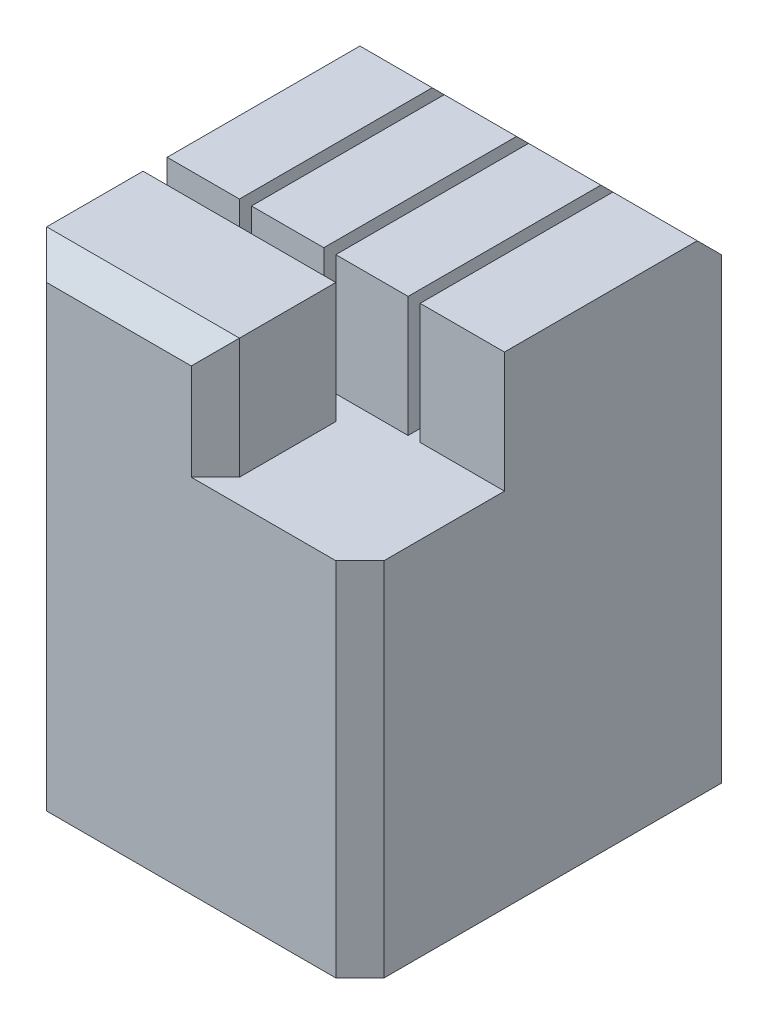
ISO-10303-21;
HEADER;
FILE_DESCRIPTION(('STEP AP214'),'2;1');
FILE_NAME('part.step','',(''),(''),'','','');
FILE_SCHEMA(('AUTOMOTIVE_DESIGN { 1 0 10303 214 1 1 1 1 }'));
ENDSEC;
DATA;
#1=APPLICATION_CONTEXT('core data for automotive mechanical design processes');
#2=APPLICATION_PROTOCOL_DEFINITION('international standard','automotive_design',2000,#1);
#3=PRODUCT_CONTEXT('',#1,'mechanical');
#4=PRODUCT('Part','Part','',(#3));
#5=PRODUCT_RELATED_PRODUCT_CATEGORY('part','',(#4));
#6=PRODUCT_DEFINITION_FORMATION('','',#4);
#7=PRODUCT_DEFINITION_CONTEXT('part definition',#1,'design');
#8=PRODUCT_DEFINITION('design','',#6,#7);
#9=PRODUCT_DEFINITION_SHAPE('','',#8);
#10=(LENGTH_UNIT() NAMED_UNIT(*) SI_UNIT(.MILLI.,.METRE.));
#11=(NAMED_UNIT(*) PLANE_ANGLE_UNIT() SI_UNIT($,.RADIAN.));
#12=(NAMED_UNIT(*) SI_UNIT($,.STERADIAN.) SOLID_ANGLE_UNIT());
#13=UNCERTAINTY_MEASURE_WITH_UNIT(LENGTH_MEASURE(1.E-05),#10,'distance_accuracy_value','');
#14=(GEOMETRIC_REPRESENTATION_CONTEXT(3) GLOBAL_UNCERTAINTY_ASSIGNED_CONTEXT((#13)) GLOBAL_UNIT_ASSIGNED_CONTEXT((#10,
#11,#12)) REPRESENTATION_CONTEXT('',''));
#15=CARTESIAN_POINT('',(0.,0.,0.));
#16=DIRECTION('',(0.,0.,1.));
#17=DIRECTION('',(1.,0.,0.));
#18=AXIS2_PLACEMENT_3D('',#15,#16,#17);
#19=CARTESIAN_POINT('',(7.,-8.,-8.));
#20=DIRECTION('',(0.,-1.,0.));
#21=DIRECTION('',(0.,0.,-1.));
#22=AXIS2_PLACEMENT_3D('',#19,#20,#21);
#23=PLANE('',#22);
#24=CARTESIAN_POINT('',(7.,-8.,-8.));
#25=DIRECTION('',(0.,-1.,0.));
#26=DIRECTION('',(0.,0.,-1.));
#27=AXIS2_PLACEMENT_3D('',#24,#25,#26);
#28=CIRCLE('',#27,5.);
#29=CARTESIAN_POINT('',(7.,-8.,-13.));
#30=VERTEX_POINT('',#29);
#31=CARTESIAN_POINT('',(7.,-8.,-3.));
#32=VERTEX_POINT('',#31);
#33=EDGE_CURVE('E10',#30,#32,#28,.T.);
#34=ORIENTED_EDGE('',*,*,#33,.T.);
#35=CARTESIAN_POINT('',(7.,-8.,-8.));
#36=DIRECTION('',(0.,-1.,0.));
#37=DIRECTION('',(0.,0.,-1.));
#38=AXIS2_PLACEMENT_3D('',#35,#36,#37);
#39=CIRCLE('',#38,5.);
#40=EDGE_CURVE('E435',#32,#30,#39,.T.);
#41=ORIENTED_EDGE('',*,*,#40,.T.);
#42=EDGE_LOOP('',(#34,#41));
#43=FACE_BOUND('',#42,.T.);
#44=ADVANCED_FACE('F16',(#43),#23,.T.);
#45=CARTESIAN_POINT('',(7.,-8.,-8.));
#46=DIRECTION('',(0.,-1.,0.));
#47=DIRECTION('',(0.,0.,-1.));
#48=AXIS2_PLACEMENT_3D('',#45,#46,#47);
#49=CYLINDRICAL_SURFACE('',#48,5.);
#50=DIRECTION('',(0.,-1.,0.));
#51=VECTOR('',#50,1.);
#52=CARTESIAN_POINT('',(7.,-8.,-3.));
#53=LINE('',#52,#51);
#54=CARTESIAN_POINT('',(7.,-20.,-3.));
#55=VERTEX_POINT('',#54);
#56=EDGE_CURVE('E439',#32,#55,#53,.T.);
#57=ORIENTED_EDGE('',*,*,#56,.F.);
#58=ORIENTED_EDGE('',*,*,#33,.F.);
#59=DIRECTION('',(0.,-1.,0.));
#60=VECTOR('',#59,1.);
#61=CARTESIAN_POINT('',(7.,-8.,-13.));
#62=LINE('',#61,#60);
#63=CARTESIAN_POINT('',(7.,-20.,-13.));
#64=VERTEX_POINT('',#63);
#65=EDGE_CURVE('E570',#30,#64,#62,.T.);
#66=ORIENTED_EDGE('',*,*,#65,.T.);
#67=CARTESIAN_POINT('',(7.,-20.,-8.));
#68=DIRECTION('',(0.,-1.,0.));
#69=DIRECTION('',(0.,0.,-1.));
#70=AXIS2_PLACEMENT_3D('',#67,#68,#69);
#71=CIRCLE('',#70,5.);
#72=EDGE_CURVE('E618',#64,#55,#71,.T.);
#73=ORIENTED_EDGE('',*,*,#72,.T.);
#74=EDGE_LOOP('',(#57,#58,#66,#73));
#75=FACE_BOUND('',#74,.T.);
#76=ADVANCED_FACE('F798',(#75),#49,.F.);
#77=CARTESIAN_POINT('',(7.,-20.,0.));
#78=DIRECTION('',(0.707106781186546,0.,0.707106781186549));
#79=DIRECTION('',(0.,-1.,0.));
#80=AXIS2_PLACEMENT_3D('',#77,#78,#79);
#81=PLANE('',#80);
#82=DIRECTION('',(-0.707106781186549,0.,0.707106781186546));
#83=VECTOR('',#82,1.);
#84=CARTESIAN_POINT('',(7.,-5.,0.));
#85=LINE('',#84,#83);
#86=CARTESIAN_POINT('',(8.,-5.,-1.));
#87=VERTEX_POINT('',#86);
#88=CARTESIAN_POINT('',(7.,-5.,0.));
#89=VERTEX_POINT('',#88);
#90=EDGE_CURVE('E40',#87,#89,#85,.T.);
#91=ORIENTED_EDGE('',*,*,#90,.F.);
#92=DIRECTION('',(0.,-1.,0.));
#93=VECTOR('',#92,1.);
#94=CARTESIAN_POINT('',(8.,-5.,-1.));
#95=LINE('',#94,#93);
#96=CARTESIAN_POINT('',(8.,0.,-1.));
#97=VERTEX_POINT('',#96);
#98=EDGE_CURVE('E359',#97,#87,#95,.T.);
#99=ORIENTED_EDGE('',*,*,#98,.F.);
#100=DIRECTION('',(-0.577350269189626,-0.577350269189626,0.577350269189625));
#101=VECTOR('',#100,1.);
#102=CARTESIAN_POINT('',(5.33333333333333,-2.66666666666667,1.66666666666666));
#103=LINE('',#102,#101);
#104=CARTESIAN_POINT('',(7.,-1.,0.));
#105=VERTEX_POINT('',#104);
#106=EDGE_CURVE('E26',#97,#105,#103,.T.);
#107=ORIENTED_EDGE('',*,*,#106,.T.);
#108=DIRECTION('',(0.,1.,0.));
#109=VECTOR('',#108,1.);
#110=CARTESIAN_POINT('',(7.,0.,0.));
#111=LINE('',#110,#109);
#112=EDGE_CURVE('E356',#89,#105,#111,.T.);
#113=ORIENTED_EDGE('',*,*,#112,.F.);
#114=EDGE_LOOP('',(#91,#99,#107,#113));
#115=FACE_BOUND('',#114,.T.);
#116=ADVANCED_FACE('F354',(#115),#81,.T.);
#117=CARTESIAN_POINT('',(0.,0.,-1.));
#118=DIRECTION('',(0.,0.707106781186546,0.707106781186549));
#119=DIRECTION('',(1.,0.,0.));
#120=AXIS2_PLACEMENT_3D('',#117,#118,#119);
#121=PLANE('',#120);
#122=DIRECTION('',(0.577350269189626,-0.577350269189626,0.577350269189625));
#123=VECTOR('',#122,1.);
#124=CARTESIAN_POINT('',(0.,0.,-1.));
#125=LINE('',#124,#123);
#126=CARTESIAN_POINT('',(0.,0.,-1.));
#127=VERTEX_POINT('',#126);
#128=CARTESIAN_POINT('',(1.,-1.,0.));
#129=VERTEX_POINT('',#128);
#130=EDGE_CURVE('E349',#127,#129,#125,.T.);
#131=ORIENTED_EDGE('',*,*,#130,.T.);
#132=DIRECTION('',(-1.,0.,0.));
#133=VECTOR('',#132,1.);
#134=CARTESIAN_POINT('',(0.,-1.,0.));
#135=LINE('',#134,#133);
#136=EDGE_CURVE('E364',#105,#129,#135,.T.);
#137=ORIENTED_EDGE('',*,*,#136,.F.);
#138=ORIENTED_EDGE('',*,*,#106,.F.);
#139=DIRECTION('',(1.,0.,0.));
#140=VECTOR('',#139,1.);
#141=CARTESIAN_POINT('',(8.,0.,-1.));
#142=LINE('',#141,#140);
#143=EDGE_CURVE('E613',#127,#97,#142,.T.);
#144=ORIENTED_EDGE('',*,*,#143,.F.);
#145=EDGE_LOOP('',(#131,#137,#138,#144));
#146=FACE_BOUND('',#145,.T.);
#147=ADVANCED_FACE('F365',(#146),#121,.T.);
#148=CARTESIAN_POINT('',(0.,-20.,-1.));
#149=DIRECTION('',(0.707106781186546,0.,-0.707106781186549));
#150=DIRECTION('',(0.,-1.,0.));
#151=AXIS2_PLACEMENT_3D('',#148,#149,#150);
#152=PLANE('',#151);
#153=DIRECTION('',(-0.707106781186549,0.,-0.707106781186546));
#154=VECTOR('',#153,1.);
#155=CARTESIAN_POINT('',(0.5,-20.,-0.5));
#156=LINE('',#155,#154);
#157=CARTESIAN_POINT('',(1.,-20.,0.));
#158=VERTEX_POINT('',#157);
#159=CARTESIAN_POINT('',(0.,-20.,-1.));
#160=VERTEX_POINT('',#159);
#161=EDGE_CURVE('E330',#158,#160,#156,.T.);
#162=ORIENTED_EDGE('',*,*,#161,.F.);
#163=DIRECTION('',(0.,-1.,0.));
#164=VECTOR('',#163,1.);
#165=CARTESIAN_POINT('',(1.,-20.,0.));
#166=LINE('',#165,#164);
#167=EDGE_CURVE('E369',#129,#158,#166,.T.);
#168=ORIENTED_EDGE('',*,*,#167,.F.);
#169=ORIENTED_EDGE('',*,*,#130,.F.);
#170=DIRECTION('',(0.,1.,0.));
#171=VECTOR('',#170,1.);
#172=CARTESIAN_POINT('',(0.,-20.,-1.));
#173=LINE('',#172,#171);
#174=EDGE_CURVE('E514',#160,#127,#173,.T.);
#175=ORIENTED_EDGE('',*,*,#174,.F.);
#176=EDGE_LOOP('',(#162,#168,#169,#175));
#177=FACE_BOUND('',#176,.T.);
#178=ADVANCED_FACE('F780',(#177),#152,.F.);
#179=CARTESIAN_POINT('',(14.,-20.,-15.));
#180=DIRECTION('',(-0.707106781186545,0.,0.70710678118655));
#181=DIRECTION('',(0.,1.,0.));
#182=AXIS2_PLACEMENT_3D('',#179,#180,#181);
#183=PLANE('',#182);
#184=DIRECTION('',(0.70710678118655,0.,0.707106781186545));
#185=VECTOR('',#184,1.);
#186=CARTESIAN_POINT('',(14.5,-20.,-14.5));
#187=LINE('',#186,#185);
#188=CARTESIAN_POINT('',(13.,-20.,-16.));
#189=VERTEX_POINT('',#188);
#190=CARTESIAN_POINT('',(14.,-20.,-15.));
#191=VERTEX_POINT('',#190);
#192=EDGE_CURVE('E657',#189,#191,#187,.T.);
#193=ORIENTED_EDGE('',*,*,#192,.F.);
#194=DIRECTION('',(0.,-1.,0.));
#195=VECTOR('',#194,1.);
#196=CARTESIAN_POINT('',(13.,-20.,-16.));
#197=LINE('',#196,#195);
#198=CARTESIAN_POINT('',(13.,-2.,-16.));
#199=VERTEX_POINT('',#198);
#200=EDGE_CURVE('E537',#199,#189,#197,.T.);
#201=ORIENTED_EDGE('',*,*,#200,.F.);
#202=DIRECTION('',(-0.577350269189627,-0.577350269189626,-0.577350269189624));
#203=VECTOR('',#202,1.);
#204=CARTESIAN_POINT('',(10.,-5.,-19.));
#205=LINE('',#204,#203);
#206=CARTESIAN_POINT('',(14.,-1.,-15.));
#207=VERTEX_POINT('',#206);
#208=EDGE_CURVE('E520',#207,#199,#205,.T.);
#209=ORIENTED_EDGE('',*,*,#208,.F.);
#210=DIRECTION('',(0.,1.,0.));
#211=VECTOR('',#210,1.);
#212=CARTESIAN_POINT('',(14.,-20.,-15.));
#213=LINE('',#212,#211);
#214=EDGE_CURVE('E479',#191,#207,#213,.T.);
#215=ORIENTED_EDGE('',*,*,#214,.F.);
#216=EDGE_LOOP('',(#193,#201,#209,#215));
#217=FACE_BOUND('',#216,.T.);
#218=ADVANCED_FACE('F656',(#217),#183,.F.);
#219=CARTESIAN_POINT('',(1.,-20.,-16.));
#220=DIRECTION('',(0.707106781186549,0.,0.707106781186546));
#221=DIRECTION('',(0.,-1.,0.));
#222=AXIS2_PLACEMENT_3D('',#219,#220,#221);
#223=PLANE('',#222);
#224=DIRECTION('',(0.707106781186546,0.,-0.707106781186549));
#225=VECTOR('',#224,1.);
#226=CARTESIAN_POINT('',(-7.5,-20.,-7.5));
#227=LINE('',#226,#225);
#228=CARTESIAN_POINT('',(0.,-20.,-15.));
#229=VERTEX_POINT('',#228);
#230=CARTESIAN_POINT('',(1.,-20.,-16.));
#231=VERTEX_POINT('',#230);
#232=EDGE_CURVE('E233',#229,#231,#227,.T.);
#233=ORIENTED_EDGE('',*,*,#232,.F.);
#234=DIRECTION('',(0.,-1.,0.));
#235=VECTOR('',#234,1.);
#236=CARTESIAN_POINT('',(0.,-20.,-15.));
#237=LINE('',#236,#235);
#238=CARTESIAN_POINT('',(0.,-1.,-15.));
#239=VERTEX_POINT('',#238);
#240=EDGE_CURVE('E442',#239,#229,#237,.T.);
#241=ORIENTED_EDGE('',*,*,#240,.F.);
#242=DIRECTION('',(-0.577350269189624,0.577350269189629,0.577350269189625));
#243=VECTOR('',#242,1.);
#244=CARTESIAN_POINT('',(-0.666666666666663,-0.33333333333333,-14.3333333333333));
#245=LINE('',#244,#243);
#246=CARTESIAN_POINT('',(1.,-2.,-16.));
#247=VERTEX_POINT('',#246);
#248=EDGE_CURVE('E217',#247,#239,#245,.T.);
#249=ORIENTED_EDGE('',*,*,#248,.F.);
#250=DIRECTION('',(0.,1.,0.));
#251=VECTOR('',#250,1.);
#252=CARTESIAN_POINT('',(1.,-20.,-16.));
#253=LINE('',#252,#251);
#254=EDGE_CURVE('E492',#231,#247,#253,.T.);
#255=ORIENTED_EDGE('',*,*,#254,.F.);
#256=EDGE_LOOP('',(#233,#241,#249,#255));
#257=FACE_BOUND('',#256,.T.);
#258=ADVANCED_FACE('F850',(#257),#223,.F.);
#259=CARTESIAN_POINT('',(13.,-20.,0.));
#260=DIRECTION('',(-0.707106781186549,0.,-0.707106781186546));
#261=DIRECTION('',(-0.707106781186546,0.,0.707106781186549));
#262=AXIS2_PLACEMENT_3D('',#259,#260,#261);
#263=PLANE('',#262);
#264=DIRECTION('',(-0.707106781186546,0.,0.707106781186549));
#265=VECTOR('',#264,1.);
#266=CARTESIAN_POINT('',(6.5,-20.,6.5));
#267=LINE('',#266,#265);
#268=CARTESIAN_POINT('',(14.,-20.,-1.));
#269=VERTEX_POINT('',#268);
#270=CARTESIAN_POINT('',(13.,-20.,0.));
#271=VERTEX_POINT('',#270);
#272=EDGE_CURVE('E450',#269,#271,#267,.T.);
#273=ORIENTED_EDGE('',*,*,#272,.F.);
#274=DIRECTION('',(0.,-1.,0.));
#275=VECTOR('',#274,1.);
#276=CARTESIAN_POINT('',(14.,-20.,-1.));
#277=LINE('',#276,#275);
#278=CARTESIAN_POINT('',(14.,-5.,-1.));
#279=VERTEX_POINT('',#278);
#280=EDGE_CURVE('E420',#279,#269,#277,.T.);
#281=ORIENTED_EDGE('',*,*,#280,.F.);
#282=DIRECTION('',(0.707106781186546,0.,-0.707106781186549));
#283=VECTOR('',#282,1.);
#284=CARTESIAN_POINT('',(6.5,-5.,6.5));
#285=LINE('',#284,#283);
#286=CARTESIAN_POINT('',(13.,-5.,0.));
#287=VERTEX_POINT('',#286);
#288=EDGE_CURVE('E433',#287,#279,#285,.T.);
#289=ORIENTED_EDGE('',*,*,#288,.F.);
#290=DIRECTION('',(0.,1.,0.));
#291=VECTOR('',#290,1.);
#292=CARTESIAN_POINT('',(13.,-20.,0.));
#293=LINE('',#292,#291);
#294=EDGE_CURVE('E382',#271,#287,#293,.T.);
#295=ORIENTED_EDGE('',*,*,#294,.F.);
#296=EDGE_LOOP('',(#273,#281,#289,#295));
#297=FACE_BOUND('',#296,.T.);
#298=ADVANCED_FACE('F861',(#297),#263,.F.);
#299=CARTESIAN_POINT('',(0.,0.,-14.));
#300=DIRECTION('',(0.,0.707106781186546,-0.707106781186549));
#301=DIRECTION('',(-1.,0.,0.));
#302=AXIS2_PLACEMENT_3D('',#299,#300,#301);
#303=PLANE('',#302);
#304=DIRECTION('',(0.,0.707106781186549,0.707106781186546));
#305=VECTOR('',#304,1.);
#306=CARTESIAN_POINT('',(14.,-3.00000000000005,-17.));
#307=LINE('',#306,#305);
#308=CARTESIAN_POINT('',(14.,0.,-14.));
#309=VERTEX_POINT('',#308);
#310=EDGE_CURVE('E483',#207,#309,#307,.T.);
#311=ORIENTED_EDGE('',*,*,#310,.F.);
#312=ORIENTED_EDGE('',*,*,#208,.T.);
#313=DIRECTION('',(1.,0.,0.));
#314=VECTOR('',#313,1.);
#315=CARTESIAN_POINT('',(14.,-2.,-16.));
#316=LINE('',#315,#314);
#317=CARTESIAN_POINT('',(10.5,-2.,-16.));
#318=VERTEX_POINT('',#317);
#319=EDGE_CURVE('E605',#318,#199,#316,.T.);
#320=ORIENTED_EDGE('',*,*,#319,.F.);
#321=DIRECTION('',(0.,-0.707106781186549,-0.707106781186546));
#322=VECTOR('',#321,1.);
#323=CARTESIAN_POINT('',(10.5,4.5,-9.5));
#324=LINE('',#323,#322);
#325=CARTESIAN_POINT('',(10.5,0.,-14.));
#326=VERTEX_POINT('',#325);
#327=EDGE_CURVE('E133',#326,#318,#324,.T.);
#328=ORIENTED_EDGE('',*,*,#327,.F.);
#329=DIRECTION('',(-1.,0.,0.));
#330=VECTOR('',#329,1.);
#331=CARTESIAN_POINT('',(10.5,0.,-14.));
#332=LINE('',#331,#330);
#333=EDGE_CURVE('E544',#309,#326,#332,.T.);
#334=ORIENTED_EDGE('',*,*,#333,.F.);
#335=EDGE_LOOP('',(#311,#312,#320,#328,#334));
#336=FACE_BOUND('',#335,.T.);
#337=ADVANCED_FACE('F651',(#336),#303,.T.);
#338=CARTESIAN_POINT('',(0.,0.,-14.));
#339=DIRECTION('',(0.,0.707106781186546,-0.707106781186549));
#340=DIRECTION('',(-1.,0.,0.));
#341=AXIS2_PLACEMENT_3D('',#338,#339,#340);
#342=PLANE('',#341);
#343=DIRECTION('',(0.,0.707106781186549,0.707106781186546));
#344=VECTOR('',#343,1.);
#345=CARTESIAN_POINT('',(10.,0.,-14.));
#346=LINE('',#345,#344);
#347=CARTESIAN_POINT('',(10.,-2.,-16.));
#348=VERTEX_POINT('',#347);
#349=CARTESIAN_POINT('',(10.,0.,-14.));
#350=VERTEX_POINT('',#349);
#351=EDGE_CURVE('E431',#348,#350,#346,.T.);
#352=ORIENTED_EDGE('',*,*,#351,.F.);
#353=DIRECTION('',(1.,0.,0.));
#354=VECTOR('',#353,1.);
#355=CARTESIAN_POINT('',(10.,-2.,-16.));
#356=LINE('',#355,#354);
#357=CARTESIAN_POINT('',(7.,-2.,-16.));
#358=VERTEX_POINT('',#357);
#359=EDGE_CURVE('E20',#358,#348,#356,.T.);
#360=ORIENTED_EDGE('',*,*,#359,.F.);
#361=DIRECTION('',(0.,-0.707106781186549,-0.707106781186546));
#362=VECTOR('',#361,1.);
#363=CARTESIAN_POINT('',(7.,4.5,-9.5));
#364=LINE('',#363,#362);
#365=CARTESIAN_POINT('',(7.,0.,-14.));
#366=VERTEX_POINT('',#365);
#367=EDGE_CURVE('E191',#366,#358,#364,.T.);
#368=ORIENTED_EDGE('',*,*,#367,.F.);
#369=DIRECTION('',(-1.,0.,0.));
#370=VECTOR('',#369,1.);
#371=CARTESIAN_POINT('',(7.,0.,-14.));
#372=LINE('',#371,#370);
#373=EDGE_CURVE('E413',#350,#366,#372,.T.);
#374=ORIENTED_EDGE('',*,*,#373,.F.);
#375=EDGE_LOOP('',(#352,#360,#368,#374));
#376=FACE_BOUND('',#375,.T.);
#377=ADVANCED_FACE('F743',(#376),#342,.T.);
#378=CARTESIAN_POINT('',(0.,0.,-14.));
#379=DIRECTION('',(0.,0.707106781186546,-0.707106781186549));
#380=DIRECTION('',(-1.,0.,0.));
#381=AXIS2_PLACEMENT_3D('',#378,#379,#380);
#382=PLANE('',#381);
#383=DIRECTION('',(0.,0.707106781186549,0.707106781186546));
#384=VECTOR('',#383,1.);
#385=CARTESIAN_POINT('',(6.5,0.,-14.));
#386=LINE('',#385,#384);
#387=CARTESIAN_POINT('',(6.5,-2.,-16.));
#388=VERTEX_POINT('',#387);
#389=CARTESIAN_POINT('',(6.5,0.,-14.));
#390=VERTEX_POINT('',#389);
#391=EDGE_CURVE('E428',#388,#390,#386,.T.);
#392=ORIENTED_EDGE('',*,*,#391,.F.);
#393=DIRECTION('',(1.,0.,0.));
#394=VECTOR('',#393,1.);
#395=CARTESIAN_POINT('',(6.5,-2.,-16.));
#396=LINE('',#395,#394);
#397=CARTESIAN_POINT('',(3.5,-2.,-16.));
#398=VERTEX_POINT('',#397);
#399=EDGE_CURVE('E560',#398,#388,#396,.T.);
#400=ORIENTED_EDGE('',*,*,#399,.F.);
#401=DIRECTION('',(0.,-0.707106781186549,-0.707106781186546));
#402=VECTOR('',#401,1.);
#403=CARTESIAN_POINT('',(3.5,4.5,-9.5));
#404=LINE('',#403,#402);
#405=CARTESIAN_POINT('',(3.5,0.,-14.));
#406=VERTEX_POINT('',#405);
#407=EDGE_CURVE('E490',#406,#398,#404,.T.);
#408=ORIENTED_EDGE('',*,*,#407,.F.);
#409=DIRECTION('',(-1.,0.,0.));
#410=VECTOR('',#409,1.);
#411=CARTESIAN_POINT('',(3.5,0.,-14.));
#412=LINE('',#411,#410);
#413=EDGE_CURVE('E464',#390,#406,#412,.T.);
#414=ORIENTED_EDGE('',*,*,#413,.F.);
#415=EDGE_LOOP('',(#392,#400,#408,#414));
#416=FACE_BOUND('',#415,.T.);
#417=ADVANCED_FACE('F723',(#416),#382,.T.);
#418=CARTESIAN_POINT('',(0.,0.,-14.));
#419=DIRECTION('',(0.,0.707106781186546,-0.707106781186549));
#420=DIRECTION('',(-1.,0.,0.));
#421=AXIS2_PLACEMENT_3D('',#418,#419,#420);
#422=PLANE('',#421);
#423=DIRECTION('',(1.,0.,0.));
#424=VECTOR('',#423,1.);
#425=CARTESIAN_POINT('',(3.,-2.,-16.));
#426=LINE('',#425,#424);
#427=CARTESIAN_POINT('',(3.,-2.,-16.));
#428=VERTEX_POINT('',#427);
#429=EDGE_CURVE('E496',#247,#428,#426,.T.);
#430=ORIENTED_EDGE('',*,*,#429,.F.);
#431=ORIENTED_EDGE('',*,*,#248,.T.);
#432=DIRECTION('',(0.,-0.707106781186549,-0.707106781186546));
#433=VECTOR('',#432,1.);
#434=CARTESIAN_POINT('',(0.,-3.00000000000005,-17.));
#435=LINE('',#434,#433);
#436=CARTESIAN_POINT('',(0.,0.,-14.));
#437=VERTEX_POINT('',#436);
#438=EDGE_CURVE('E447',#437,#239,#435,.T.);
#439=ORIENTED_EDGE('',*,*,#438,.F.);
#440=DIRECTION('',(-1.,0.,0.));
#441=VECTOR('',#440,1.);
#442=CARTESIAN_POINT('',(0.,0.,-14.));
#443=LINE('',#442,#441);
#444=CARTESIAN_POINT('',(3.,0.,-14.));
#445=VERTEX_POINT('',#444);
#446=EDGE_CURVE('E593',#445,#437,#443,.T.);
#447=ORIENTED_EDGE('',*,*,#446,.F.);
#448=DIRECTION('',(0.,0.707106781186549,0.707106781186546));
#449=VECTOR('',#448,1.);
#450=CARTESIAN_POINT('',(3.,0.,-14.));
#451=LINE('',#450,#449);
#452=EDGE_CURVE('E491',#428,#445,#451,.T.);
#453=ORIENTED_EDGE('',*,*,#452,.F.);
#454=EDGE_LOOP('',(#430,#431,#439,#447,#453));
#455=FACE_BOUND('',#454,.T.);
#456=ADVANCED_FACE('F752',(#455),#422,.T.);
#457=CARTESIAN_POINT('',(0.,-5.,0.));
#458=DIRECTION('',(0.,1.,0.));
#459=DIRECTION('',(1.,0.,0.));
#460=AXIS2_PLACEMENT_3D('',#457,#458,#459);
#461=PLANE('',#460);
#462=DIRECTION('',(1.,0.,0.));
#463=VECTOR('',#462,1.);
#464=CARTESIAN_POINT('',(0.,-5.,0.));
#465=LINE('',#464,#463);
#466=EDGE_CURVE('E375',#89,#287,#465,.T.);
#467=ORIENTED_EDGE('',*,*,#466,.T.);
#468=ORIENTED_EDGE('',*,*,#288,.T.);
#469=DIRECTION('',(0.,0.,-1.));
#470=VECTOR('',#469,1.);
#471=CARTESIAN_POINT('',(14.,-5.,0.));
#472=LINE('',#471,#470);
#473=CARTESIAN_POINT('',(14.,-5.,-6.));
#474=VERTEX_POINT('',#473);
#475=EDGE_CURVE('E425',#279,#474,#472,.T.);
#476=ORIENTED_EDGE('',*,*,#475,.T.);
#477=DIRECTION('',(1.,0.,0.));
#478=VECTOR('',#477,1.);
#479=CARTESIAN_POINT('',(0.,-5.,-6.));
#480=LINE('',#479,#478);
#481=CARTESIAN_POINT('',(10.5,-5.,-6.));
#482=VERTEX_POINT('',#481);
#483=EDGE_CURVE('E54',#482,#474,#480,.T.);
#484=ORIENTED_EDGE('',*,*,#483,.F.);
#485=DIRECTION('',(0.,0.,1.));
#486=VECTOR('',#485,1.);
#487=CARTESIAN_POINT('',(10.5,-5.,0.));
#488=LINE('',#487,#486);
#489=CARTESIAN_POINT('',(10.5,-5.,-16.));
#490=VERTEX_POINT('',#489);
#491=EDGE_CURVE('E398',#490,#482,#488,.T.);
#492=ORIENTED_EDGE('',*,*,#491,.F.);
#493=DIRECTION('',(-1.,0.,0.));
#494=VECTOR('',#493,1.);
#495=CARTESIAN_POINT('',(0.,-5.,-16.));
#496=LINE('',#495,#494);
#497=CARTESIAN_POINT('',(10.,-5.,-16.));
#498=VERTEX_POINT('',#497);
#499=EDGE_CURVE('E469',#490,#498,#496,.T.);
#500=ORIENTED_EDGE('',*,*,#499,.T.);
#501=DIRECTION('',(0.,0.,1.));
#502=VECTOR('',#501,1.);
#503=CARTESIAN_POINT('',(10.,-5.,0.));
#504=LINE('',#503,#502);
#505=CARTESIAN_POINT('',(10.,-5.,-6.));
#506=VERTEX_POINT('',#505);
#507=EDGE_CURVE('E399',#498,#506,#504,.T.);
#508=ORIENTED_EDGE('',*,*,#507,.T.);
#509=DIRECTION('',(1.,0.,0.));
#510=VECTOR('',#509,1.);
#511=CARTESIAN_POINT('',(0.,-5.,-6.));
#512=LINE('',#511,#510);
#513=CARTESIAN_POINT('',(7.,-5.,-6.));
#514=VERTEX_POINT('',#513);
#515=EDGE_CURVE('E463',#514,#506,#512,.T.);
#516=ORIENTED_EDGE('',*,*,#515,.F.);
#517=DIRECTION('',(0.,0.,1.));
#518=VECTOR('',#517,1.);
#519=CARTESIAN_POINT('',(7.,-5.,0.));
#520=LINE('',#519,#518);
#521=CARTESIAN_POINT('',(7.,-5.,-16.));
#522=VERTEX_POINT('',#521);
#523=EDGE_CURVE('E386',#522,#514,#520,.T.);
#524=ORIENTED_EDGE('',*,*,#523,.F.);
#525=DIRECTION('',(-1.,0.,0.));
#526=VECTOR('',#525,1.);
#527=CARTESIAN_POINT('',(0.,-5.,-16.));
#528=LINE('',#527,#526);
#529=CARTESIAN_POINT('',(6.5,-5.,-16.));
#530=VERTEX_POINT('',#529);
#531=EDGE_CURVE('E571',#522,#530,#528,.T.);
#532=ORIENTED_EDGE('',*,*,#531,.T.);
#533=DIRECTION('',(0.,0.,1.));
#534=VECTOR('',#533,1.);
#535=CARTESIAN_POINT('',(6.5,-5.,0.));
#536=LINE('',#535,#534);
#537=CARTESIAN_POINT('',(6.5,-5.,-6.));
#538=VERTEX_POINT('',#537);
#539=EDGE_CURVE('E511',#530,#538,#536,.T.);
#540=ORIENTED_EDGE('',*,*,#539,.T.);
#541=DIRECTION('',(1.,0.,0.));
#542=VECTOR('',#541,1.);
#543=CARTESIAN_POINT('',(0.,-5.,-6.));
#544=LINE('',#543,#542);
#545=CARTESIAN_POINT('',(3.5,-5.,-6.));
#546=VERTEX_POINT('',#545);
#547=EDGE_CURVE('E390',#546,#538,#544,.T.);
#548=ORIENTED_EDGE('',*,*,#547,.F.);
#549=DIRECTION('',(0.,0.,1.));
#550=VECTOR('',#549,1.);
#551=CARTESIAN_POINT('',(3.5,-5.,0.));
#552=LINE('',#551,#550);
#553=CARTESIAN_POINT('',(3.5,-5.,-16.));
#554=VERTEX_POINT('',#553);
#555=EDGE_CURVE('E453',#554,#546,#552,.T.);
#556=ORIENTED_EDGE('',*,*,#555,.F.);
#557=DIRECTION('',(-1.,0.,0.));
#558=VECTOR('',#557,1.);
#559=CARTESIAN_POINT('',(0.,-5.,-16.));
#560=LINE('',#559,#558);
#561=CARTESIAN_POINT('',(3.,-5.,-16.));
#562=VERTEX_POINT('',#561);
#563=EDGE_CURVE('E551',#554,#562,#560,.T.);
#564=ORIENTED_EDGE('',*,*,#563,.T.);
#565=DIRECTION('',(0.,0.,1.));
#566=VECTOR('',#565,1.);
#567=CARTESIAN_POINT('',(3.,-5.,0.));
#568=LINE('',#567,#566);
#569=CARTESIAN_POINT('',(3.,-5.,-6.));
#570=VERTEX_POINT('',#569);
#571=EDGE_CURVE('E487',#562,#570,#568,.T.);
#572=ORIENTED_EDGE('',*,*,#571,.T.);
#573=DIRECTION('',(1.,0.,0.));
#574=VECTOR('',#573,1.);
#575=CARTESIAN_POINT('',(0.,-5.,-6.));
#576=LINE('',#575,#574);
#577=CARTESIAN_POINT('',(0.,-5.,-6.));
#578=VERTEX_POINT('',#577);
#579=EDGE_CURVE('E580',#578,#570,#576,.T.);
#580=ORIENTED_EDGE('',*,*,#579,.F.);
#581=DIRECTION('',(0.,0.,1.));
#582=VECTOR('',#581,1.);
#583=CARTESIAN_POINT('',(0.,-5.,0.));
#584=LINE('',#583,#582);
#585=CARTESIAN_POINT('',(0.,-5.,-5.));
#586=VERTEX_POINT('',#585);
#587=EDGE_CURVE('E418',#578,#586,#584,.T.);
#588=ORIENTED_EDGE('',*,*,#587,.T.);
#589=DIRECTION('',(1.,0.,0.));
#590=VECTOR('',#589,1.);
#591=CARTESIAN_POINT('',(0.,-5.,-5.));
#592=LINE('',#591,#590);
#593=CARTESIAN_POINT('',(8.,-5.,-5.));
#594=VERTEX_POINT('',#593);
#595=EDGE_CURVE('E261',#586,#594,#592,.T.);
#596=ORIENTED_EDGE('',*,*,#595,.T.);
#597=DIRECTION('',(0.,0.,1.));
#598=VECTOR('',#597,1.);
#599=CARTESIAN_POINT('',(8.,-5.,0.));
#600=LINE('',#599,#598);
#601=EDGE_CURVE('E402',#594,#87,#600,.T.);
#602=ORIENTED_EDGE('',*,*,#601,.T.);
#603=ORIENTED_EDGE('',*,*,#90,.T.);
#604=EDGE_LOOP('',(#467,#468,#476,#484,#492,#500,#508,#516,#524,#532,#540,#548,#556,#564,#572,
#580,#588,#596,#602,#603));
#605=FACE_BOUND('',#604,.T.);
#606=ADVANCED_FACE('F738',(#605),#461,.T.);
#607=CARTESIAN_POINT('',(8.,-5.,0.));
#608=DIRECTION('',(-1.,0.,0.));
#609=DIRECTION('',(0.,0.,1.));
#610=AXIS2_PLACEMENT_3D('',#607,#608,#609);
#611=PLANE('',#610);
#612=DIRECTION('',(0.,0.,1.));
#613=VECTOR('',#612,1.);
#614=CARTESIAN_POINT('',(8.,0.,0.));
#615=LINE('',#614,#613);
#616=CARTESIAN_POINT('',(8.,0.,-5.));
#617=VERTEX_POINT('',#616);
#618=EDGE_CURVE('E617',#617,#97,#615,.T.);
#619=ORIENTED_EDGE('',*,*,#618,.T.);
#620=ORIENTED_EDGE('',*,*,#98,.T.);
#621=ORIENTED_EDGE('',*,*,#601,.F.);
#622=DIRECTION('',(0.,1.,0.));
#623=VECTOR('',#622,1.);
#624=CARTESIAN_POINT('',(8.,-5.,-5.));
#625=LINE('',#624,#623);
#626=EDGE_CURVE('E458',#594,#617,#625,.T.);
#627=ORIENTED_EDGE('',*,*,#626,.T.);
#628=EDGE_LOOP('',(#619,#620,#621,#627));
#629=FACE_BOUND('',#628,.T.);
#630=ADVANCED_FACE('F823',(#629),#611,.F.);
#631=CARTESIAN_POINT('',(0.,-5.,-6.));
#632=DIRECTION('',(0.,0.,1.));
#633=DIRECTION('',(1.,0.,0.));
#634=AXIS2_PLACEMENT_3D('',#631,#632,#633);
#635=PLANE('',#634);
#636=DIRECTION('',(1.,0.,0.));
#637=VECTOR('',#636,1.);
#638=CARTESIAN_POINT('',(0.,0.,-6.));
#639=LINE('',#638,#637);
#640=CARTESIAN_POINT('',(10.5,0.,-6.));
#641=VERTEX_POINT('',#640);
#642=CARTESIAN_POINT('',(14.,0.,-6.));
#643=VERTEX_POINT('',#642);
#644=EDGE_CURVE('E457',#641,#643,#639,.T.);
#645=ORIENTED_EDGE('',*,*,#644,.F.);
#646=DIRECTION('',(0.,1.,0.));
#647=VECTOR('',#646,1.);
#648=CARTESIAN_POINT('',(10.5,-5.,-6.));
#649=LINE('',#648,#647);
#650=EDGE_CURVE('E116',#482,#641,#649,.T.);
#651=ORIENTED_EDGE('',*,*,#650,.F.);
#652=ORIENTED_EDGE('',*,*,#483,.T.);
#653=DIRECTION('',(0.,1.,0.));
#654=VECTOR('',#653,1.);
#655=CARTESIAN_POINT('',(14.,-5.,-6.));
#656=LINE('',#655,#654);
#657=EDGE_CURVE('E538',#474,#643,#656,.T.);
#658=ORIENTED_EDGE('',*,*,#657,.T.);
#659=EDGE_LOOP('',(#645,#651,#652,#658));
#660=FACE_BOUND('',#659,.T.);
#661=ADVANCED_FACE('F828',(#660),#635,.T.);
#662=CARTESIAN_POINT('',(10.5,-5.,0.));
#663=DIRECTION('',(-1.,0.,0.));
#664=DIRECTION('',(0.,1.,0.));
#665=AXIS2_PLACEMENT_3D('',#662,#663,#664);
#666=PLANE('',#665);
#667=DIRECTION('',(0.,0.,1.));
#668=VECTOR('',#667,1.);
#669=CARTESIAN_POINT('',(10.5,0.,0.));
#670=LINE('',#669,#668);
#671=EDGE_CURVE('E508',#326,#641,#670,.T.);
#672=ORIENTED_EDGE('',*,*,#671,.F.);
#673=ORIENTED_EDGE('',*,*,#327,.T.);
#674=DIRECTION('',(0.,1.,0.));
#675=VECTOR('',#674,1.);
#676=CARTESIAN_POINT('',(10.5,-5.,-16.));
#677=LINE('',#676,#675);
#678=EDGE_CURVE('E473',#490,#318,#677,.T.);
#679=ORIENTED_EDGE('',*,*,#678,.F.);
#680=ORIENTED_EDGE('',*,*,#491,.T.);
#681=ORIENTED_EDGE('',*,*,#650,.T.);
#682=EDGE_LOOP('',(#672,#673,#679,#680,#681));
#683=FACE_BOUND('',#682,.T.);
#684=ADVANCED_FACE('F649',(#683),#666,.T.);
#685=CARTESIAN_POINT('',(10.,-5.,0.));
#686=DIRECTION('',(-1.,0.,0.));
#687=DIRECTION('',(0.,1.,0.));
#688=AXIS2_PLACEMENT_3D('',#685,#686,#687);
#689=PLANE('',#688);
#690=DIRECTION('',(0.,1.,0.));
#691=VECTOR('',#690,1.);
#692=CARTESIAN_POINT('',(10.,-5.,-16.));
#693=LINE('',#692,#691);
#694=EDGE_CURVE('E474',#498,#348,#693,.T.);
#695=ORIENTED_EDGE('',*,*,#694,.T.);
#696=ORIENTED_EDGE('',*,*,#351,.T.);
#697=DIRECTION('',(0.,0.,1.));
#698=VECTOR('',#697,1.);
#699=CARTESIAN_POINT('',(10.,0.,0.));
#700=LINE('',#699,#698);
#701=CARTESIAN_POINT('',(10.,0.,-6.));
#702=VERTEX_POINT('',#701);
#703=EDGE_CURVE('E409',#350,#702,#700,.T.);
#704=ORIENTED_EDGE('',*,*,#703,.T.);
#705=DIRECTION('',(0.,1.,0.));
#706=VECTOR('',#705,1.);
#707=CARTESIAN_POINT('',(10.,-5.,-6.));
#708=LINE('',#707,#706);
#709=EDGE_CURVE('E203',#506,#702,#708,.T.);
#710=ORIENTED_EDGE('',*,*,#709,.F.);
#711=ORIENTED_EDGE('',*,*,#507,.F.);
#712=EDGE_LOOP('',(#695,#696,#704,#710,#711));
#713=FACE_BOUND('',#712,.T.);
#714=ADVANCED_FACE('F917',(#713),#689,.F.);
#715=CARTESIAN_POINT('',(0.,-5.,-6.));
#716=DIRECTION('',(0.,0.,1.));
#717=DIRECTION('',(1.,0.,0.));
#718=AXIS2_PLACEMENT_3D('',#715,#716,#717);
#719=PLANE('',#718);
#720=DIRECTION('',(1.,0.,0.));
#721=VECTOR('',#720,1.);
#722=CARTESIAN_POINT('',(0.,0.,-6.));
#723=LINE('',#722,#721);
#724=CARTESIAN_POINT('',(7.,0.,-6.));
#725=VERTEX_POINT('',#724);
#726=EDGE_CURVE('E505',#725,#702,#723,.T.);
#727=ORIENTED_EDGE('',*,*,#726,.F.);
#728=DIRECTION('',(0.,1.,0.));
#729=VECTOR('',#728,1.);
#730=CARTESIAN_POINT('',(7.,-5.,-6.));
#731=LINE('',#730,#729);
#732=EDGE_CURVE('E389',#514,#725,#731,.T.);
#733=ORIENTED_EDGE('',*,*,#732,.F.);
#734=ORIENTED_EDGE('',*,*,#515,.T.);
#735=ORIENTED_EDGE('',*,*,#709,.T.);
#736=EDGE_LOOP('',(#727,#733,#734,#735));
#737=FACE_BOUND('',#736,.T.);
#738=ADVANCED_FACE('F18',(#737),#719,.T.);
#739=CARTESIAN_POINT('',(7.,-5.,0.));
#740=DIRECTION('',(-1.,0.,0.));
#741=DIRECTION('',(0.,1.,0.));
#742=AXIS2_PLACEMENT_3D('',#739,#740,#741);
#743=PLANE('',#742);
#744=DIRECTION('',(0.,0.,1.));
#745=VECTOR('',#744,1.);
#746=CARTESIAN_POINT('',(7.,0.,0.));
#747=LINE('',#746,#745);
#748=EDGE_CURVE('E501',#366,#725,#747,.T.);
#749=ORIENTED_EDGE('',*,*,#748,.F.);
#750=ORIENTED_EDGE('',*,*,#367,.T.);
#751=DIRECTION('',(0.,1.,0.));
#752=VECTOR('',#751,1.);
#753=CARTESIAN_POINT('',(7.,-5.,-16.));
#754=LINE('',#753,#752);
#755=EDGE_CURVE('E575',#522,#358,#754,.T.);
#756=ORIENTED_EDGE('',*,*,#755,.F.);
#757=ORIENTED_EDGE('',*,*,#523,.T.);
#758=ORIENTED_EDGE('',*,*,#732,.T.);
#759=EDGE_LOOP('',(#749,#750,#756,#757,#758));
#760=FACE_BOUND('',#759,.T.);
#761=ADVANCED_FACE('F742',(#760),#743,.T.);
#762=CARTESIAN_POINT('',(6.5,-5.,0.));
#763=DIRECTION('',(-1.,0.,0.));
#764=DIRECTION('',(0.,1.,0.));
#765=AXIS2_PLACEMENT_3D('',#762,#763,#764);
#766=PLANE('',#765);
#767=DIRECTION('',(0.,1.,0.));
#768=VECTOR('',#767,1.);
#769=CARTESIAN_POINT('',(6.5,-5.,-16.));
#770=LINE('',#769,#768);
#771=EDGE_CURVE('E576',#530,#388,#770,.T.);
#772=ORIENTED_EDGE('',*,*,#771,.T.);
#773=ORIENTED_EDGE('',*,*,#391,.T.);
#774=DIRECTION('',(0.,0.,1.));
#775=VECTOR('',#774,1.);
#776=CARTESIAN_POINT('',(6.5,0.,0.));
#777=LINE('',#776,#775);
#778=CARTESIAN_POINT('',(6.5,0.,-6.));
#779=VERTEX_POINT('',#778);
#780=EDGE_CURVE('E407',#390,#779,#777,.T.);
#781=ORIENTED_EDGE('',*,*,#780,.T.);
#782=DIRECTION('',(0.,1.,0.));
#783=VECTOR('',#782,1.);
#784=CARTESIAN_POINT('',(6.5,-5.,-6.));
#785=LINE('',#784,#783);
#786=EDGE_CURVE('E394',#538,#779,#785,.T.);
#787=ORIENTED_EDGE('',*,*,#786,.F.);
#788=ORIENTED_EDGE('',*,*,#539,.F.);
#789=EDGE_LOOP('',(#772,#773,#781,#787,#788));
#790=FACE_BOUND('',#789,.T.);
#791=ADVANCED_FACE('F737',(#790),#766,.F.);
#792=CARTESIAN_POINT('',(0.,-5.,-6.));
#793=DIRECTION('',(0.,0.,1.));
#794=DIRECTION('',(1.,0.,0.));
#795=AXIS2_PLACEMENT_3D('',#792,#793,#794);
#796=PLANE('',#795);
#797=DIRECTION('',(1.,0.,0.));
#798=VECTOR('',#797,1.);
#799=CARTESIAN_POINT('',(0.,0.,-6.));
#800=LINE('',#799,#798);
#801=CARTESIAN_POINT('',(3.5,0.,-6.));
#802=VERTEX_POINT('',#801);
#803=EDGE_CURVE('E414',#802,#779,#800,.T.);
#804=ORIENTED_EDGE('',*,*,#803,.F.);
#805=DIRECTION('',(0.,1.,0.));
#806=VECTOR('',#805,1.);
#807=CARTESIAN_POINT('',(3.5,-5.,-6.));
#808=LINE('',#807,#806);
#809=EDGE_CURVE('E395',#546,#802,#808,.T.);
#810=ORIENTED_EDGE('',*,*,#809,.F.);
#811=ORIENTED_EDGE('',*,*,#547,.T.);
#812=ORIENTED_EDGE('',*,*,#786,.T.);
#813=EDGE_LOOP('',(#804,#810,#811,#812));
#814=FACE_BOUND('',#813,.T.);
#815=ADVANCED_FACE('F946',(#814),#796,.T.);
#816=CARTESIAN_POINT('',(3.5,-5.,0.));
#817=DIRECTION('',(-1.,0.,0.));
#818=DIRECTION('',(0.,1.,0.));
#819=AXIS2_PLACEMENT_3D('',#816,#817,#818);
#820=PLANE('',#819);
#821=DIRECTION('',(0.,0.,1.));
#822=VECTOR('',#821,1.);
#823=CARTESIAN_POINT('',(3.5,0.,0.));
#824=LINE('',#823,#822);
#825=EDGE_CURVE('E468',#406,#802,#824,.T.);
#826=ORIENTED_EDGE('',*,*,#825,.F.);
#827=ORIENTED_EDGE('',*,*,#407,.T.);
#828=DIRECTION('',(0.,1.,0.));
#829=VECTOR('',#828,1.);
#830=CARTESIAN_POINT('',(3.5,-5.,-16.));
#831=LINE('',#830,#829);
#832=EDGE_CURVE('E555',#554,#398,#831,.T.);
#833=ORIENTED_EDGE('',*,*,#832,.F.);
#834=ORIENTED_EDGE('',*,*,#555,.T.);
#835=ORIENTED_EDGE('',*,*,#809,.T.);
#836=EDGE_LOOP('',(#826,#827,#833,#834,#835));
#837=FACE_BOUND('',#836,.T.);
#838=ADVANCED_FACE('F729',(#837),#820,.T.);
#839=CARTESIAN_POINT('',(3.,-5.,0.));
#840=DIRECTION('',(-1.,0.,0.));
#841=DIRECTION('',(0.,1.,0.));
#842=AXIS2_PLACEMENT_3D('',#839,#840,#841);
#843=PLANE('',#842);
#844=DIRECTION('',(0.,1.,0.));
#845=VECTOR('',#844,1.);
#846=CARTESIAN_POINT('',(3.,-5.,-16.));
#847=LINE('',#846,#845);
#848=EDGE_CURVE('E556',#562,#428,#847,.T.);
#849=ORIENTED_EDGE('',*,*,#848,.T.);
#850=ORIENTED_EDGE('',*,*,#452,.T.);
#851=DIRECTION('',(0.,0.,1.));
#852=VECTOR('',#851,1.);
#853=CARTESIAN_POINT('',(3.,0.,0.));
#854=LINE('',#853,#852);
#855=CARTESIAN_POINT('',(3.,0.,-6.));
#856=VERTEX_POINT('',#855);
#857=EDGE_CURVE('E542',#445,#856,#854,.T.);
#858=ORIENTED_EDGE('',*,*,#857,.T.);
#859=DIRECTION('',(0.,1.,0.));
#860=VECTOR('',#859,1.);
#861=CARTESIAN_POINT('',(3.,-5.,-6.));
#862=LINE('',#861,#860);
#863=EDGE_CURVE('E563',#570,#856,#862,.T.);
#864=ORIENTED_EDGE('',*,*,#863,.F.);
#865=ORIENTED_EDGE('',*,*,#571,.F.);
#866=EDGE_LOOP('',(#849,#850,#858,#864,#865));
#867=FACE_BOUND('',#866,.T.);
#868=ADVANCED_FACE('F875',(#867),#843,.F.);
#869=CARTESIAN_POINT('',(0.,-5.,-6.));
#870=DIRECTION('',(0.,0.,1.));
#871=DIRECTION('',(1.,0.,0.));
#872=AXIS2_PLACEMENT_3D('',#869,#870,#871);
#873=PLANE('',#872);
#874=DIRECTION('',(1.,0.,0.));
#875=VECTOR('',#874,1.);
#876=CARTESIAN_POINT('',(0.,0.,-6.));
#877=LINE('',#876,#875);
#878=CARTESIAN_POINT('',(0.,0.,-6.));
#879=VERTEX_POINT('',#878);
#880=EDGE_CURVE('E403',#879,#856,#877,.T.);
#881=ORIENTED_EDGE('',*,*,#880,.F.);
#882=DIRECTION('',(0.,1.,0.));
#883=VECTOR('',#882,1.);
#884=CARTESIAN_POINT('',(0.,-5.,-6.));
#885=LINE('',#884,#883);
#886=EDGE_CURVE('E526',#578,#879,#885,.T.);
#887=ORIENTED_EDGE('',*,*,#886,.F.);
#888=ORIENTED_EDGE('',*,*,#579,.T.);
#889=ORIENTED_EDGE('',*,*,#863,.T.);
#890=EDGE_LOOP('',(#881,#887,#888,#889));
#891=FACE_BOUND('',#890,.T.);
#892=ADVANCED_FACE('F869',(#891),#873,.T.);
#893=CARTESIAN_POINT('',(0.,-5.,-5.));
#894=DIRECTION('',(0.,0.,1.));
#895=DIRECTION('',(1.,0.,0.));
#896=AXIS2_PLACEMENT_3D('',#893,#894,#895);
#897=PLANE('',#896);
#898=DIRECTION('',(1.,0.,0.));
#899=VECTOR('',#898,1.);
#900=CARTESIAN_POINT('',(0.,0.,-5.));
#901=LINE('',#900,#899);
#902=CARTESIAN_POINT('',(0.,0.,-5.));
#903=VERTEX_POINT('',#902);
#904=EDGE_CURVE('E274',#903,#617,#901,.T.);
#905=ORIENTED_EDGE('',*,*,#904,.T.);
#906=ORIENTED_EDGE('',*,*,#626,.F.);
#907=ORIENTED_EDGE('',*,*,#595,.F.);
#908=DIRECTION('',(0.,1.,0.));
#909=VECTOR('',#908,1.);
#910=CARTESIAN_POINT('',(0.,-5.,-5.));
#911=LINE('',#910,#909);
#912=EDGE_CURVE('E415',#586,#903,#911,.T.);
#913=ORIENTED_EDGE('',*,*,#912,.T.);
#914=EDGE_LOOP('',(#905,#906,#907,#913));
#915=FACE_BOUND('',#914,.T.);
#916=ADVANCED_FACE('F874',(#915),#897,.F.);
#917=CARTESIAN_POINT('',(0.,0.,0.));
#918=DIRECTION('',(0.,-1.,0.));
#919=DIRECTION('',(0.,0.,-1.));
#920=AXIS2_PLACEMENT_3D('',#917,#918,#919);
#921=PLANE('',#920);
#922=DIRECTION('',(0.,0.,1.));
#923=VECTOR('',#922,1.);
#924=CARTESIAN_POINT('',(0.,0.,0.));
#925=LINE('',#924,#923);
#926=EDGE_CURVE('E419',#903,#127,#925,.T.);
#927=ORIENTED_EDGE('',*,*,#926,.T.);
#928=ORIENTED_EDGE('',*,*,#143,.T.);
#929=ORIENTED_EDGE('',*,*,#618,.F.);
#930=ORIENTED_EDGE('',*,*,#904,.F.);
#931=EDGE_LOOP('',(#927,#928,#929,#930));
#932=FACE_BOUND('',#931,.T.);
#933=ADVANCED_FACE('F909',(#932),#921,.F.);
#934=CARTESIAN_POINT('',(0.,-20.,0.));
#935=DIRECTION('',(0.,-1.,0.));
#936=DIRECTION('',(0.,0.,-1.));
#937=AXIS2_PLACEMENT_3D('',#934,#935,#936);
#938=PLANE('',#937);
#939=ORIENTED_EDGE('',*,*,#72,.F.);
#940=CARTESIAN_POINT('',(7.,-20.,-8.));
#941=DIRECTION('',(0.,-1.,0.));
#942=DIRECTION('',(0.,0.,-1.));
#943=AXIS2_PLACEMENT_3D('',#940,#941,#942);
#944=CIRCLE('',#943,5.);
#945=EDGE_CURVE('E478',#55,#64,#944,.T.);
#946=ORIENTED_EDGE('',*,*,#945,.F.);
#947=EDGE_LOOP('',(#939,#946));
#948=FACE_BOUND('',#947,.T.);
#949=DIRECTION('',(0.,0.,-1.));
#950=VECTOR('',#949,1.);
#951=CARTESIAN_POINT('',(14.,-20.,0.));
#952=LINE('',#951,#950);
#953=EDGE_CURVE('E424',#269,#191,#952,.T.);
#954=ORIENTED_EDGE('',*,*,#953,.F.);
#955=ORIENTED_EDGE('',*,*,#272,.T.);
#956=DIRECTION('',(1.,0.,0.));
#957=VECTOR('',#956,1.);
#958=CARTESIAN_POINT('',(0.,-20.,0.));
#959=LINE('',#958,#957);
#960=EDGE_CURVE('E500',#158,#271,#959,.T.);
#961=ORIENTED_EDGE('',*,*,#960,.F.);
#962=ORIENTED_EDGE('',*,*,#161,.T.);
#963=DIRECTION('',(0.,0.,1.));
#964=VECTOR('',#963,1.);
#965=CARTESIAN_POINT('',(0.,-20.,0.));
#966=LINE('',#965,#964);
#967=EDGE_CURVE('E446',#229,#160,#966,.T.);
#968=ORIENTED_EDGE('',*,*,#967,.F.);
#969=ORIENTED_EDGE('',*,*,#232,.T.);
#970=DIRECTION('',(-1.,0.,0.));
#971=VECTOR('',#970,1.);
#972=CARTESIAN_POINT('',(0.,-20.,-16.));
#973=LINE('',#972,#971);
#974=EDGE_CURVE('E497',#189,#231,#973,.T.);
#975=ORIENTED_EDGE('',*,*,#974,.F.);
#976=ORIENTED_EDGE('',*,*,#192,.T.);
#977=EDGE_LOOP('',(#954,#955,#961,#962,#968,#969,#975,#976));
#978=FACE_BOUND('',#977,.T.);
#979=ADVANCED_FACE('F659',(#948,#978),#938,.T.);
#980=CARTESIAN_POINT('',(0.,-20.,0.));
#981=DIRECTION('',(0.,0.,1.));
#982=DIRECTION('',(1.,0.,0.));
#983=AXIS2_PLACEMENT_3D('',#980,#981,#982);
#984=PLANE('',#983);
#985=ORIENTED_EDGE('',*,*,#960,.T.);
#986=ORIENTED_EDGE('',*,*,#294,.T.);
#987=ORIENTED_EDGE('',*,*,#466,.F.);
#988=ORIENTED_EDGE('',*,*,#112,.T.);
#989=ORIENTED_EDGE('',*,*,#136,.T.);
#990=ORIENTED_EDGE('',*,*,#167,.T.);
#991=EDGE_LOOP('',(#985,#986,#987,#988,#989,#990));
#992=FACE_BOUND('',#991,.T.);
#993=ADVANCED_FACE('F372',(#992),#984,.T.);
#994=CARTESIAN_POINT('',(0.,-20.,-16.));
#995=DIRECTION('',(0.,0.,-1.));
#996=DIRECTION('',(0.,-1.,0.));
#997=AXIS2_PLACEMENT_3D('',#994,#995,#996);
#998=PLANE('',#997);
#999=ORIENTED_EDGE('',*,*,#974,.T.);
#1000=ORIENTED_EDGE('',*,*,#254,.T.);
#1001=ORIENTED_EDGE('',*,*,#429,.T.);
#1002=ORIENTED_EDGE('',*,*,#848,.F.);
#1003=ORIENTED_EDGE('',*,*,#563,.F.);
#1004=ORIENTED_EDGE('',*,*,#832,.T.);
#1005=ORIENTED_EDGE('',*,*,#399,.T.);
#1006=ORIENTED_EDGE('',*,*,#771,.F.);
#1007=ORIENTED_EDGE('',*,*,#531,.F.);
#1008=ORIENTED_EDGE('',*,*,#755,.T.);
#1009=ORIENTED_EDGE('',*,*,#359,.T.);
#1010=ORIENTED_EDGE('',*,*,#694,.F.);
#1011=ORIENTED_EDGE('',*,*,#499,.F.);
#1012=ORIENTED_EDGE('',*,*,#678,.T.);
#1013=ORIENTED_EDGE('',*,*,#319,.T.);
#1014=ORIENTED_EDGE('',*,*,#200,.T.);
#1015=EDGE_LOOP('',(#999,#1000,#1001,#1002,#1003,#1004,#1005,#1006,#1007,#1008,#1009,#1010,
#1011,#1012,#1013,#1014));
#1016=FACE_BOUND('',#1015,.T.);
#1017=ADVANCED_FACE('F647',(#1016),#998,.T.);
#1018=CARTESIAN_POINT('',(0.,-20.,0.));
#1019=DIRECTION('',(-1.,0.,0.));
#1020=DIRECTION('',(0.,0.,1.));
#1021=AXIS2_PLACEMENT_3D('',#1018,#1019,#1020);
#1022=PLANE('',#1021);
#1023=ORIENTED_EDGE('',*,*,#438,.T.);
#1024=ORIENTED_EDGE('',*,*,#240,.T.);
#1025=ORIENTED_EDGE('',*,*,#967,.T.);
#1026=ORIENTED_EDGE('',*,*,#174,.T.);
#1027=ORIENTED_EDGE('',*,*,#926,.F.);
#1028=ORIENTED_EDGE('',*,*,#912,.F.);
#1029=ORIENTED_EDGE('',*,*,#587,.F.);
#1030=ORIENTED_EDGE('',*,*,#886,.T.);
#1031=DIRECTION('',(0.,0.,1.));
#1032=VECTOR('',#1031,1.);
#1033=CARTESIAN_POINT('',(0.,0.,0.));
#1034=LINE('',#1033,#1032);
#1035=EDGE_CURVE('E408',#437,#879,#1034,.T.);
#1036=ORIENTED_EDGE('',*,*,#1035,.F.);
#1037=EDGE_LOOP('',(#1023,#1024,#1025,#1026,#1027,#1028,#1029,#1030,#1036));
#1038=FACE_BOUND('',#1037,.T.);
#1039=ADVANCED_FACE('F771',(#1038),#1022,.T.);
#1040=CARTESIAN_POINT('',(0.,0.,0.));
#1041=DIRECTION('',(0.,-1.,0.));
#1042=DIRECTION('',(0.,0.,-1.));
#1043=AXIS2_PLACEMENT_3D('',#1040,#1041,#1042);
#1044=PLANE('',#1043);
#1045=DIRECTION('',(0.,0.,-1.));
#1046=VECTOR('',#1045,1.);
#1047=CARTESIAN_POINT('',(14.,0.,0.));
#1048=LINE('',#1047,#1046);
#1049=EDGE_CURVE('E543',#643,#309,#1048,.T.);
#1050=ORIENTED_EDGE('',*,*,#1049,.T.);
#1051=ORIENTED_EDGE('',*,*,#333,.T.);
#1052=ORIENTED_EDGE('',*,*,#671,.T.);
#1053=ORIENTED_EDGE('',*,*,#644,.T.);
#1054=EDGE_LOOP('',(#1050,#1051,#1052,#1053));
#1055=FACE_BOUND('',#1054,.T.);
#1056=ADVANCED_FACE('F997',(#1055),#1044,.F.);
#1057=CARTESIAN_POINT('',(0.,0.,0.));
#1058=DIRECTION('',(0.,-1.,0.));
#1059=DIRECTION('',(0.,0.,-1.));
#1060=AXIS2_PLACEMENT_3D('',#1057,#1058,#1059);
#1061=PLANE('',#1060);
#1062=ORIENTED_EDGE('',*,*,#703,.F.);
#1063=ORIENTED_EDGE('',*,*,#373,.T.);
#1064=ORIENTED_EDGE('',*,*,#748,.T.);
#1065=ORIENTED_EDGE('',*,*,#726,.T.);
#1066=EDGE_LOOP('',(#1062,#1063,#1064,#1065));
#1067=FACE_BOUND('',#1066,.T.);
#1068=ADVANCED_FACE('F934',(#1067),#1061,.F.);
#1069=CARTESIAN_POINT('',(0.,0.,0.));
#1070=DIRECTION('',(0.,-1.,0.));
#1071=DIRECTION('',(0.,0.,-1.));
#1072=AXIS2_PLACEMENT_3D('',#1069,#1070,#1071);
#1073=PLANE('',#1072);
#1074=ORIENTED_EDGE('',*,*,#780,.F.);
#1075=ORIENTED_EDGE('',*,*,#413,.T.);
#1076=ORIENTED_EDGE('',*,*,#825,.T.);
#1077=ORIENTED_EDGE('',*,*,#803,.T.);
#1078=EDGE_LOOP('',(#1074,#1075,#1076,#1077));
#1079=FACE_BOUND('',#1078,.T.);
#1080=ADVANCED_FACE('F734',(#1079),#1073,.F.);
#1081=CARTESIAN_POINT('',(0.,0.,0.));
#1082=DIRECTION('',(0.,-1.,0.));
#1083=DIRECTION('',(0.,0.,-1.));
#1084=AXIS2_PLACEMENT_3D('',#1081,#1082,#1083);
#1085=PLANE('',#1084);
#1086=ORIENTED_EDGE('',*,*,#857,.F.);
#1087=ORIENTED_EDGE('',*,*,#446,.T.);
#1088=ORIENTED_EDGE('',*,*,#1035,.T.);
#1089=ORIENTED_EDGE('',*,*,#880,.T.);
#1090=EDGE_LOOP('',(#1086,#1087,#1088,#1089));
#1091=FACE_BOUND('',#1090,.T.);
#1092=ADVANCED_FACE('F813',(#1091),#1085,.F.);
#1093=CARTESIAN_POINT('',(14.,-20.,0.));
#1094=DIRECTION('',(1.,0.,0.));
#1095=DIRECTION('',(0.,1.,0.));
#1096=AXIS2_PLACEMENT_3D('',#1093,#1094,#1095);
#1097=PLANE('',#1096);
#1098=ORIENTED_EDGE('',*,*,#475,.F.);
#1099=ORIENTED_EDGE('',*,*,#280,.T.);
#1100=ORIENTED_EDGE('',*,*,#953,.T.);
#1101=ORIENTED_EDGE('',*,*,#214,.T.);
#1102=ORIENTED_EDGE('',*,*,#310,.T.);
#1103=ORIENTED_EDGE('',*,*,#1049,.F.);
#1104=ORIENTED_EDGE('',*,*,#657,.F.);
#1105=EDGE_LOOP('',(#1098,#1099,#1100,#1101,#1102,#1103,#1104));
#1106=FACE_BOUND('',#1105,.T.);
#1107=ADVANCED_FACE('F807',(#1106),#1097,.T.);
#1108=CARTESIAN_POINT('',(7.,-8.,-8.));
#1109=DIRECTION('',(0.,-1.,0.));
#1110=DIRECTION('',(0.,0.,-1.));
#1111=AXIS2_PLACEMENT_3D('',#1108,#1109,#1110);
#1112=CYLINDRICAL_SURFACE('',#1111,5.);
#1113=ORIENTED_EDGE('',*,*,#40,.F.);
#1114=ORIENTED_EDGE('',*,*,#56,.T.);
#1115=ORIENTED_EDGE('',*,*,#945,.T.);
#1116=ORIENTED_EDGE('',*,*,#65,.F.);
#1117=EDGE_LOOP('',(#1113,#1114,#1115,#1116));
#1118=FACE_BOUND('',#1117,.T.);
#1119=ADVANCED_FACE('F812',(#1118),#1112,.F.);
#1120=CLOSED_SHELL('',(#44,#76,#116,#147,#178,#218,#258,#298,#337,#377,#417,#456,#606,#630,#661,
#684,#714,#738,#761,#791,#815,#838,#868,#892,#916,#933,#979,#993,#1017,#1039,#1056,#1068,#1080,
#1092,#1107,#1119));
#1121=MANIFOLD_SOLID_BREP('B1',#1120);
#1122=ADVANCED_BREP_SHAPE_REPRESENTATION('',(#18,#1121),#14);
#1123=SHAPE_DEFINITION_REPRESENTATION(#9,#1122);
ENDSEC;
END-ISO-10303-21;
